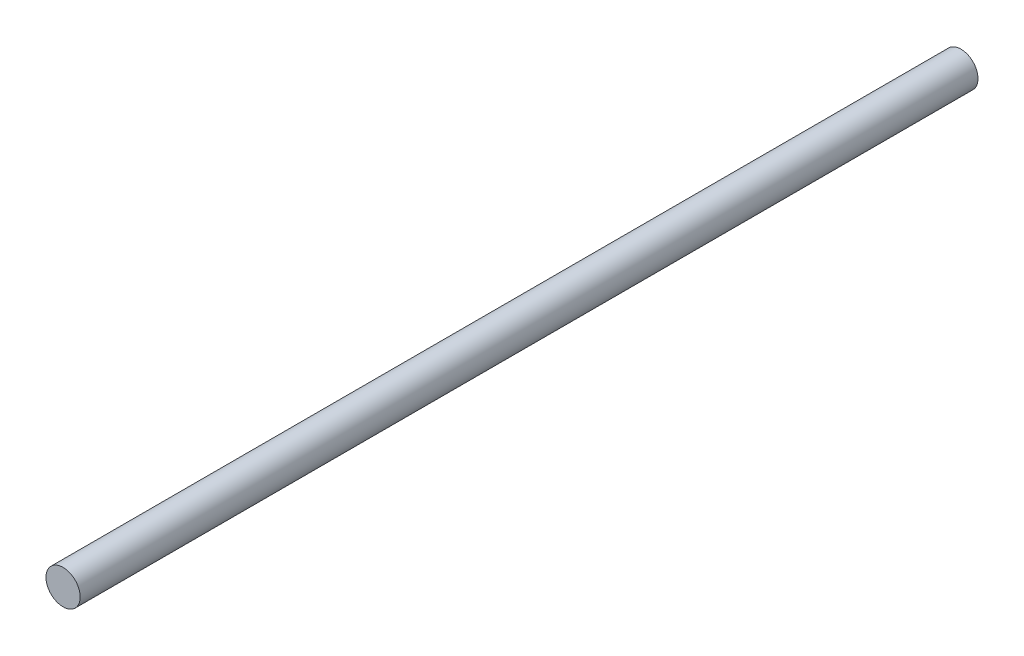
ISO-10303-21;
HEADER;
FILE_DESCRIPTION(('STEP AP214'),'2;1');
FILE_NAME('part.step','',(''),(''),'','','');
FILE_SCHEMA(('AUTOMOTIVE_DESIGN { 1 0 10303 214 1 1 1 1 }'));
ENDSEC;
DATA;
#1=APPLICATION_CONTEXT('core data for automotive mechanical design processes');
#2=APPLICATION_PROTOCOL_DEFINITION('international standard','automotive_design',2000,#1);
#3=PRODUCT_CONTEXT('',#1,'mechanical');
#4=PRODUCT('Part','Part','',(#3));
#5=PRODUCT_RELATED_PRODUCT_CATEGORY('part','',(#4));
#6=PRODUCT_DEFINITION_FORMATION('','',#4);
#7=PRODUCT_DEFINITION_CONTEXT('part definition',#1,'design');
#8=PRODUCT_DEFINITION('design','',#6,#7);
#9=PRODUCT_DEFINITION_SHAPE('','',#8);
#10=(LENGTH_UNIT() NAMED_UNIT(*) SI_UNIT(.MILLI.,.METRE.));
#11=(NAMED_UNIT(*) PLANE_ANGLE_UNIT() SI_UNIT($,.RADIAN.));
#12=(NAMED_UNIT(*) SI_UNIT($,.STERADIAN.) SOLID_ANGLE_UNIT());
#13=UNCERTAINTY_MEASURE_WITH_UNIT(LENGTH_MEASURE(1.E-05),#10,'distance_accuracy_value','');
#14=(GEOMETRIC_REPRESENTATION_CONTEXT(3) GLOBAL_UNCERTAINTY_ASSIGNED_CONTEXT((#13)) GLOBAL_UNIT_ASSIGNED_CONTEXT((#10,
#11,#12)) REPRESENTATION_CONTEXT('',''));
#15=CARTESIAN_POINT('',(0.,0.,0.));
#16=DIRECTION('',(0.,0.,1.));
#17=DIRECTION('',(1.,0.,0.));
#18=AXIS2_PLACEMENT_3D('',#15,#16,#17);
#19=CARTESIAN_POINT('',(0.,0.,-103.2));
#20=DIRECTION('',(0.,0.,1.));
#21=DIRECTION('',(1.,0.,0.));
#22=AXIS2_PLACEMENT_3D('',#19,#20,#21);
#23=CYLINDRICAL_SURFACE('',#22,8.89);
#24=CARTESIAN_POINT('',(0.,0.,-103.2));
#25=DIRECTION('',(0.,0.,1.));
#26=DIRECTION('',(1.,0.,0.));
#27=AXIS2_PLACEMENT_3D('',#24,#25,#26);
#28=CIRCLE('',#27,8.89);
#29=CARTESIAN_POINT('',(8.89,0.,-103.2));
#30=VERTEX_POINT('',#29);
#31=EDGE_CURVE('E10',#30,#30,#28,.T.);
#32=ORIENTED_EDGE('',*,*,#31,.T.);
#33=EDGE_LOOP('',(#32));
#34=FACE_BOUND('',#33,.T.);
#35=CARTESIAN_POINT('',(0.,0.,363.2));
#36=DIRECTION('',(0.,0.,1.));
#37=DIRECTION('',(1.,0.,0.));
#38=AXIS2_PLACEMENT_3D('',#35,#36,#37);
#39=CIRCLE('',#38,8.89);
#40=CARTESIAN_POINT('',(8.89,0.,363.2));
#41=VERTEX_POINT('',#40);
#42=EDGE_CURVE('E43',#41,#41,#39,.T.);
#43=ORIENTED_EDGE('',*,*,#42,.F.);
#44=EDGE_LOOP('',(#43));
#45=FACE_BOUND('',#44,.T.);
#46=ADVANCED_FACE('F37',(#34,#45),#23,.T.);
#47=CARTESIAN_POINT('',(0.,0.,-103.2));
#48=DIRECTION('',(0.,0.,1.));
#49=DIRECTION('',(1.,0.,0.));
#50=AXIS2_PLACEMENT_3D('',#47,#48,#49);
#51=PLANE('',#50);
#52=ORIENTED_EDGE('',*,*,#31,.F.);
#53=EDGE_LOOP('',(#52));
#54=FACE_BOUND('',#53,.T.);
#55=ADVANCED_FACE('F52',(#54),#51,.F.);
#56=CARTESIAN_POINT('',(0.,0.,363.2));
#57=DIRECTION('',(0.,0.,1.));
#58=DIRECTION('',(1.,0.,0.));
#59=AXIS2_PLACEMENT_3D('',#56,#57,#58);
#60=PLANE('',#59);
#61=ORIENTED_EDGE('',*,*,#42,.T.);
#62=EDGE_LOOP('',(#61));
#63=FACE_BOUND('',#62,.T.);
#64=ADVANCED_FACE('F49',(#63),#60,.T.);
#65=CLOSED_SHELL('',(#46,#55,#64));
#66=MANIFOLD_SOLID_BREP('B2',#65);
#67=ADVANCED_BREP_SHAPE_REPRESENTATION('',(#18,#66),#14);
#68=SHAPE_DEFINITION_REPRESENTATION(#9,#67);
ENDSEC;
END-ISO-10303-21;
